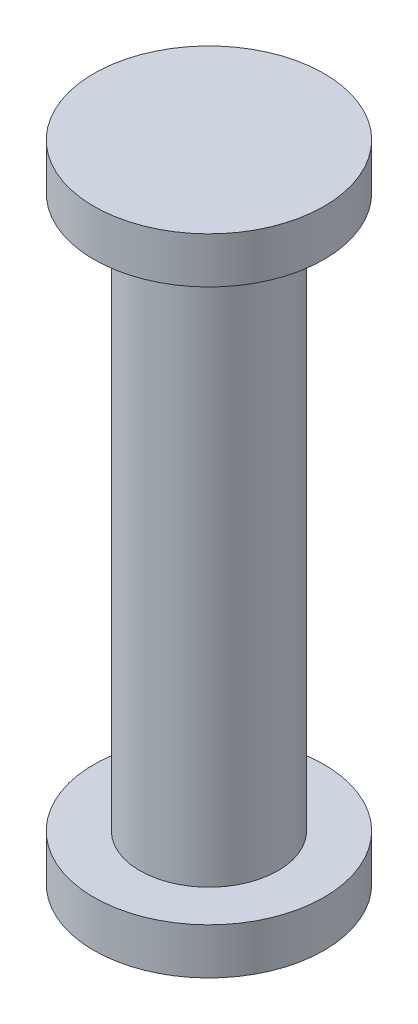
ISO-10303-21;
HEADER;
FILE_DESCRIPTION(('STEP AP214'),'2;1');
FILE_NAME('part.step','',(''),(''),'','','');
FILE_SCHEMA(('AUTOMOTIVE_DESIGN { 1 0 10303 214 1 1 1 1 }'));
ENDSEC;
DATA;
#1=APPLICATION_CONTEXT('core data for automotive mechanical design processes');
#2=APPLICATION_PROTOCOL_DEFINITION('international standard','automotive_design',2000,#1);
#3=PRODUCT_CONTEXT('',#1,'mechanical');
#4=PRODUCT('Part','Part','',(#3));
#5=PRODUCT_RELATED_PRODUCT_CATEGORY('part','',(#4));
#6=PRODUCT_DEFINITION_FORMATION('','',#4);
#7=PRODUCT_DEFINITION_CONTEXT('part definition',#1,'design');
#8=PRODUCT_DEFINITION('design','',#6,#7);
#9=PRODUCT_DEFINITION_SHAPE('','',#8);
#10=(LENGTH_UNIT() NAMED_UNIT(*) SI_UNIT(.MILLI.,.METRE.));
#11=(NAMED_UNIT(*) PLANE_ANGLE_UNIT() SI_UNIT($,.RADIAN.));
#12=(NAMED_UNIT(*) SI_UNIT($,.STERADIAN.) SOLID_ANGLE_UNIT());
#13=UNCERTAINTY_MEASURE_WITH_UNIT(LENGTH_MEASURE(1.E-05),#10,'distance_accuracy_value','');
#14=(GEOMETRIC_REPRESENTATION_CONTEXT(3) GLOBAL_UNCERTAINTY_ASSIGNED_CONTEXT((#13)) GLOBAL_UNIT_ASSIGNED_CONTEXT((#10,
#11,#12)) REPRESENTATION_CONTEXT('',''));
#15=CARTESIAN_POINT('',(0.,0.,0.));
#16=DIRECTION('',(0.,0.,1.));
#17=DIRECTION('',(1.,0.,0.));
#18=AXIS2_PLACEMENT_3D('',#15,#16,#17);
#19=CARTESIAN_POINT('',(-2.5,0.,0.));
#20=DIRECTION('',(0.,1.,0.));
#21=DIRECTION('',(-1.,0.,0.));
#22=AXIS2_PLACEMENT_3D('',#19,#20,#21);
#23=PLANE('',#22);
#24=CARTESIAN_POINT('',(0.,0.,0.));
#25=DIRECTION('',(0.,-1.,0.));
#26=DIRECTION('',(1.,0.,0.));
#27=AXIS2_PLACEMENT_3D('',#24,#25,#26);
#28=CIRCLE('',#27,2.5);
#29=CARTESIAN_POINT('',(2.5,0.,0.));
#30=VERTEX_POINT('',#29);
#31=EDGE_CURVE('E52',#30,#30,#28,.T.);
#32=ORIENTED_EDGE('',*,*,#31,.T.);
#33=EDGE_LOOP('',(#32));
#34=FACE_BOUND('',#33,.T.);
#35=ADVANCED_FACE('F30',(#34),#23,.F.);
#36=CARTESIAN_POINT('',(0.,14.,0.));
#37=DIRECTION('',(0.,-1.,0.));
#38=DIRECTION('',(1.,0.,0.));
#39=AXIS2_PLACEMENT_3D('',#36,#37,#38);
#40=PLANE('',#39);
#41=CARTESIAN_POINT('',(0.,14.,0.));
#42=DIRECTION('',(0.,-1.,0.));
#43=DIRECTION('',(1.,0.,0.));
#44=AXIS2_PLACEMENT_3D('',#41,#42,#43);
#45=CIRCLE('',#44,2.5);
#46=CARTESIAN_POINT('',(2.5,14.,0.));
#47=VERTEX_POINT('',#46);
#48=EDGE_CURVE('E10',#47,#47,#45,.T.);
#49=ORIENTED_EDGE('',*,*,#48,.F.);
#50=EDGE_LOOP('',(#49));
#51=FACE_BOUND('',#50,.T.);
#52=ADVANCED_FACE('F82',(#51),#40,.F.);
#53=CARTESIAN_POINT('',(0.,0.,0.));
#54=DIRECTION('',(0.,-1.,0.));
#55=DIRECTION('',(1.,0.,0.));
#56=AXIS2_PLACEMENT_3D('',#53,#54,#55);
#57=CYLINDRICAL_SURFACE('',#56,2.5);
#58=CARTESIAN_POINT('',(0.,13.,0.));
#59=DIRECTION('',(0.,-1.,0.));
#60=DIRECTION('',(1.,0.,0.));
#61=AXIS2_PLACEMENT_3D('',#58,#59,#60);
#62=CIRCLE('',#61,2.5);
#63=CARTESIAN_POINT('',(2.5,13.,0.));
#64=VERTEX_POINT('',#63);
#65=EDGE_CURVE('E36',#64,#64,#62,.T.);
#66=ORIENTED_EDGE('',*,*,#65,.F.);
#67=EDGE_LOOP('',(#66));
#68=FACE_BOUND('',#67,.T.);
#69=ORIENTED_EDGE('',*,*,#48,.T.);
#70=EDGE_LOOP('',(#69));
#71=FACE_BOUND('',#70,.T.);
#72=ADVANCED_FACE('F77',(#68,#71),#57,.T.);
#73=CARTESIAN_POINT('',(-2.5,13.,0.));
#74=DIRECTION('',(0.,1.,0.));
#75=DIRECTION('',(-1.,0.,0.));
#76=AXIS2_PLACEMENT_3D('',#73,#74,#75);
#77=PLANE('',#76);
#78=CARTESIAN_POINT('',(0.,13.,0.));
#79=DIRECTION('',(0.,-1.,0.));
#80=DIRECTION('',(1.,0.,0.));
#81=AXIS2_PLACEMENT_3D('',#78,#79,#80);
#82=CIRCLE('',#81,1.5);
#83=CARTESIAN_POINT('',(1.5,13.,0.));
#84=VERTEX_POINT('',#83);
#85=EDGE_CURVE('E40',#84,#84,#82,.T.);
#86=ORIENTED_EDGE('',*,*,#85,.F.);
#87=EDGE_LOOP('',(#86));
#88=FACE_BOUND('',#87,.T.);
#89=ORIENTED_EDGE('',*,*,#65,.T.);
#90=EDGE_LOOP('',(#89));
#91=FACE_BOUND('',#90,.T.);
#92=ADVANCED_FACE('F72',(#88,#91),#77,.F.);
#93=CARTESIAN_POINT('',(0.,0.,0.));
#94=DIRECTION('',(0.,-1.,0.));
#95=DIRECTION('',(1.,0.,0.));
#96=AXIS2_PLACEMENT_3D('',#93,#94,#95);
#97=CYLINDRICAL_SURFACE('',#96,1.5);
#98=CARTESIAN_POINT('',(0.,0.999999999999967,0.));
#99=DIRECTION('',(0.,-1.,0.));
#100=DIRECTION('',(1.,0.,0.));
#101=AXIS2_PLACEMENT_3D('',#98,#99,#100);
#102=CIRCLE('',#101,1.49999999999999);
#103=CARTESIAN_POINT('',(1.49999999999999,0.999999999999967,0.));
#104=VERTEX_POINT('',#103);
#105=EDGE_CURVE('E44',#104,#104,#102,.T.);
#106=ORIENTED_EDGE('',*,*,#105,.F.);
#107=EDGE_LOOP('',(#106));
#108=FACE_BOUND('',#107,.T.);
#109=ORIENTED_EDGE('',*,*,#85,.T.);
#110=EDGE_LOOP('',(#109));
#111=FACE_BOUND('',#110,.T.);
#112=ADVANCED_FACE('F66',(#108,#111),#97,.T.);
#113=CARTESIAN_POINT('',(-1.49999999999999,0.999999999999966,0.));
#114=DIRECTION('',(0.,-1.,0.));
#115=DIRECTION('',(1.,0.,0.));
#116=AXIS2_PLACEMENT_3D('',#113,#114,#115);
#117=PLANE('',#116);
#118=CARTESIAN_POINT('',(0.,0.999999999999967,0.));
#119=DIRECTION('',(0.,-1.,0.));
#120=DIRECTION('',(1.,0.,0.));
#121=AXIS2_PLACEMENT_3D('',#118,#119,#120);
#122=CIRCLE('',#121,2.49999999999999);
#123=CARTESIAN_POINT('',(2.49999999999999,0.999999999999968,0.));
#124=VERTEX_POINT('',#123);
#125=EDGE_CURVE('E49',#124,#124,#122,.T.);
#126=ORIENTED_EDGE('',*,*,#125,.F.);
#127=EDGE_LOOP('',(#126));
#128=FACE_BOUND('',#127,.T.);
#129=ORIENTED_EDGE('',*,*,#105,.T.);
#130=EDGE_LOOP('',(#129));
#131=FACE_BOUND('',#130,.T.);
#132=ADVANCED_FACE('F60',(#128,#131),#117,.F.);
#133=CARTESIAN_POINT('',(0.,0.,0.));
#134=DIRECTION('',(0.,-1.,0.));
#135=DIRECTION('',(1.,0.,0.));
#136=AXIS2_PLACEMENT_3D('',#133,#134,#135);
#137=CYLINDRICAL_SURFACE('',#136,2.49999999999999);
#138=ORIENTED_EDGE('',*,*,#31,.F.);
#139=EDGE_LOOP('',(#138));
#140=FACE_BOUND('',#139,.T.);
#141=ORIENTED_EDGE('',*,*,#125,.T.);
#142=EDGE_LOOP('',(#141));
#143=FACE_BOUND('',#142,.T.);
#144=ADVANCED_FACE('F57',(#140,#143),#137,.T.);
#145=CLOSED_SHELL('',(#35,#52,#72,#92,#112,#132,#144));
#146=MANIFOLD_SOLID_BREP('B2',#145);
#147=ADVANCED_BREP_SHAPE_REPRESENTATION('',(#18,#146),#14);
#148=SHAPE_DEFINITION_REPRESENTATION(#9,#147);
ENDSEC;
END-ISO-10303-21;
